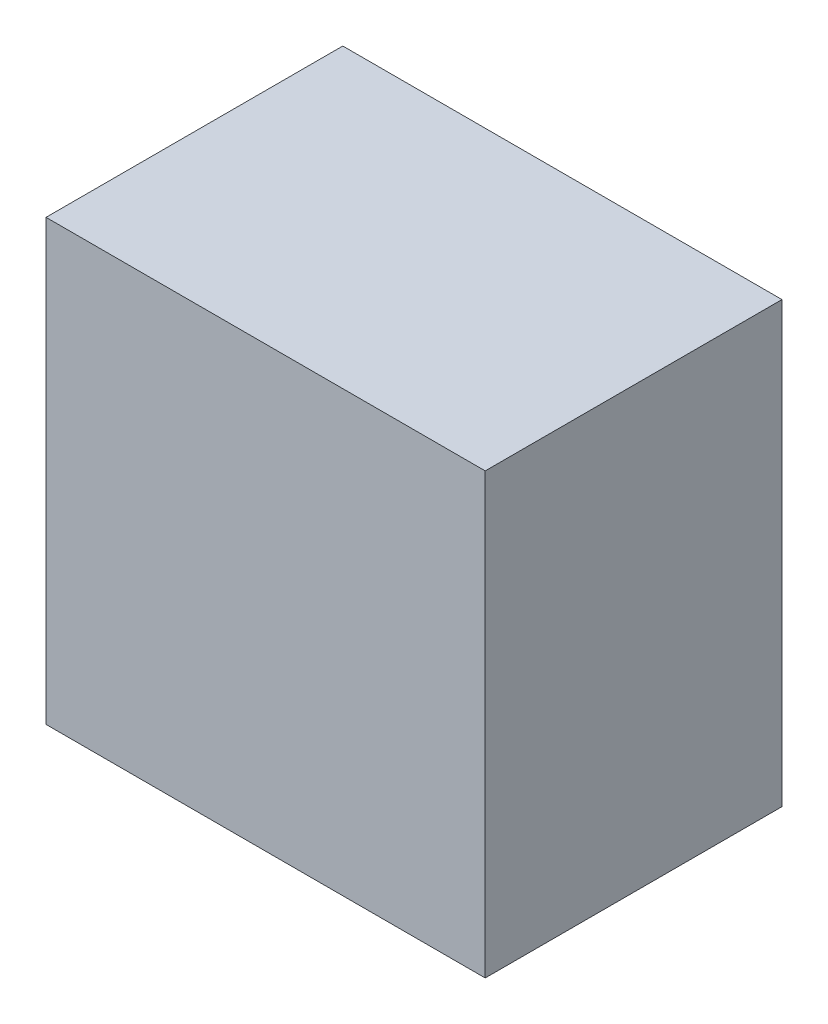
ISO-10303-21;
HEADER;
FILE_DESCRIPTION(('STEP AP214'),'2;1');
FILE_NAME('part.step','',(''),(''),'','','');
FILE_SCHEMA(('AUTOMOTIVE_DESIGN { 1 0 10303 214 1 1 1 1 }'));
ENDSEC;
DATA;
#1=APPLICATION_CONTEXT('core data for automotive mechanical design processes');
#2=APPLICATION_PROTOCOL_DEFINITION('international standard','automotive_design',2000,#1);
#3=PRODUCT_CONTEXT('',#1,'mechanical');
#4=PRODUCT('Part','Part','',(#3));
#5=PRODUCT_RELATED_PRODUCT_CATEGORY('part','',(#4));
#6=PRODUCT_DEFINITION_FORMATION('','',#4);
#7=PRODUCT_DEFINITION_CONTEXT('part definition',#1,'design');
#8=PRODUCT_DEFINITION('design','',#6,#7);
#9=PRODUCT_DEFINITION_SHAPE('','',#8);
#10=(LENGTH_UNIT() NAMED_UNIT(*) SI_UNIT(.MILLI.,.METRE.));
#11=(NAMED_UNIT(*) PLANE_ANGLE_UNIT() SI_UNIT($,.RADIAN.));
#12=(NAMED_UNIT(*) SI_UNIT($,.STERADIAN.) SOLID_ANGLE_UNIT());
#13=UNCERTAINTY_MEASURE_WITH_UNIT(LENGTH_MEASURE(1.E-05),#10,'distance_accuracy_value','');
#14=(GEOMETRIC_REPRESENTATION_CONTEXT(3) GLOBAL_UNCERTAINTY_ASSIGNED_CONTEXT((#13)) GLOBAL_UNIT_ASSIGNED_CONTEXT((#10,
#11,#12)) REPRESENTATION_CONTEXT('',''));
#15=CARTESIAN_POINT('',(0.,0.,0.));
#16=DIRECTION('',(0.,0.,1.));
#17=DIRECTION('',(1.,0.,0.));
#18=AXIS2_PLACEMENT_3D('',#15,#16,#17);
#19=CARTESIAN_POINT('',(-18.5,-18.5,25.));
#20=DIRECTION('',(1.,0.,0.));
#21=DIRECTION('',(0.,0.,-1.));
#22=AXIS2_PLACEMENT_3D('',#19,#20,#21);
#23=PLANE('',#22);
#24=DIRECTION('',(0.,-1.,0.));
#25=VECTOR('',#24,1.);
#26=CARTESIAN_POINT('',(-18.5,-18.5,0.));
#27=LINE('',#26,#25);
#28=CARTESIAN_POINT('',(-18.5,18.5,0.));
#29=VERTEX_POINT('',#28);
#30=CARTESIAN_POINT('',(-18.5,-18.5,0.));
#31=VERTEX_POINT('',#30);
#32=EDGE_CURVE('E106',#29,#31,#27,.T.);
#33=ORIENTED_EDGE('',*,*,#32,.T.);
#34=DIRECTION('',(0.,0.,-1.));
#35=VECTOR('',#34,1.);
#36=CARTESIAN_POINT('',(-18.5,-18.5,25.));
#37=LINE('',#36,#35);
#38=CARTESIAN_POINT('',(-18.5,-18.5,25.));
#39=VERTEX_POINT('',#38);
#40=EDGE_CURVE('E11',#39,#31,#37,.T.);
#41=ORIENTED_EDGE('',*,*,#40,.F.);
#42=DIRECTION('',(0.,-1.,0.));
#43=VECTOR('',#42,1.);
#44=CARTESIAN_POINT('',(-18.5,-18.5,25.));
#45=LINE('',#44,#43);
#46=CARTESIAN_POINT('',(-18.5,18.5,25.));
#47=VERTEX_POINT('',#46);
#48=EDGE_CURVE('E94',#47,#39,#45,.T.);
#49=ORIENTED_EDGE('',*,*,#48,.F.);
#50=DIRECTION('',(0.,0.,-1.));
#51=VECTOR('',#50,1.);
#52=CARTESIAN_POINT('',(-18.5,18.5,25.));
#53=LINE('',#52,#51);
#54=EDGE_CURVE('E105',#47,#29,#53,.T.);
#55=ORIENTED_EDGE('',*,*,#54,.T.);
#56=EDGE_LOOP('',(#33,#41,#49,#55));
#57=FACE_BOUND('',#56,.T.);
#58=ADVANCED_FACE('F43',(#57),#23,.F.);
#59=CARTESIAN_POINT('',(-18.5,-18.5,25.));
#60=DIRECTION('',(0.,1.,0.));
#61=DIRECTION('',(0.,0.,1.));
#62=AXIS2_PLACEMENT_3D('',#59,#60,#61);
#63=PLANE('',#62);
#64=DIRECTION('',(1.,0.,0.));
#65=VECTOR('',#64,1.);
#66=CARTESIAN_POINT('',(-18.5,-18.5,0.));
#67=LINE('',#66,#65);
#68=CARTESIAN_POINT('',(18.5,-18.5,0.));
#69=VERTEX_POINT('',#68);
#70=EDGE_CURVE('E98',#31,#69,#67,.T.);
#71=ORIENTED_EDGE('',*,*,#70,.T.);
#72=DIRECTION('',(0.,0.,-1.));
#73=VECTOR('',#72,1.);
#74=CARTESIAN_POINT('',(18.5,-18.5,25.));
#75=LINE('',#74,#73);
#76=CARTESIAN_POINT('',(18.5,-18.5,25.));
#77=VERTEX_POINT('',#76);
#78=EDGE_CURVE('E51',#77,#69,#75,.T.);
#79=ORIENTED_EDGE('',*,*,#78,.F.);
#80=DIRECTION('',(1.,0.,0.));
#81=VECTOR('',#80,1.);
#82=CARTESIAN_POINT('',(-18.5,-18.5,25.));
#83=LINE('',#82,#81);
#84=EDGE_CURVE('E90',#39,#77,#83,.T.);
#85=ORIENTED_EDGE('',*,*,#84,.F.);
#86=ORIENTED_EDGE('',*,*,#40,.T.);
#87=EDGE_LOOP('',(#71,#79,#85,#86));
#88=FACE_BOUND('',#87,.T.);
#89=ADVANCED_FACE('F100',(#88),#63,.F.);
#90=CARTESIAN_POINT('',(18.5,-18.5,25.));
#91=DIRECTION('',(-1.,0.,0.));
#92=DIRECTION('',(0.,0.,1.));
#93=AXIS2_PLACEMENT_3D('',#90,#91,#92);
#94=PLANE('',#93);
#95=DIRECTION('',(0.,1.,0.));
#96=VECTOR('',#95,1.);
#97=CARTESIAN_POINT('',(18.5,-18.5,0.));
#98=LINE('',#97,#96);
#99=CARTESIAN_POINT('',(18.5,18.5,0.));
#100=VERTEX_POINT('',#99);
#101=EDGE_CURVE('E76',#69,#100,#98,.T.);
#102=ORIENTED_EDGE('',*,*,#101,.T.);
#103=DIRECTION('',(0.,0.,-1.));
#104=VECTOR('',#103,1.);
#105=CARTESIAN_POINT('',(18.5,18.5,25.));
#106=LINE('',#105,#104);
#107=CARTESIAN_POINT('',(18.5,18.5,25.));
#108=VERTEX_POINT('',#107);
#109=EDGE_CURVE('E97',#108,#100,#106,.T.);
#110=ORIENTED_EDGE('',*,*,#109,.F.);
#111=DIRECTION('',(0.,1.,0.));
#112=VECTOR('',#111,1.);
#113=CARTESIAN_POINT('',(18.5,-18.5,25.));
#114=LINE('',#113,#112);
#115=EDGE_CURVE('E95',#77,#108,#114,.T.);
#116=ORIENTED_EDGE('',*,*,#115,.F.);
#117=ORIENTED_EDGE('',*,*,#78,.T.);
#118=EDGE_LOOP('',(#102,#110,#116,#117));
#119=FACE_BOUND('',#118,.T.);
#120=ADVANCED_FACE('F99',(#119),#94,.F.);
#121=CARTESIAN_POINT('',(-18.5,18.5,25.));
#122=DIRECTION('',(0.,-1.,0.));
#123=DIRECTION('',(0.,0.,-1.));
#124=AXIS2_PLACEMENT_3D('',#121,#122,#123);
#125=PLANE('',#124);
#126=DIRECTION('',(-1.,0.,0.));
#127=VECTOR('',#126,1.);
#128=CARTESIAN_POINT('',(-18.5,18.5,0.));
#129=LINE('',#128,#127);
#130=EDGE_CURVE('E85',#100,#29,#129,.T.);
#131=ORIENTED_EDGE('',*,*,#130,.T.);
#132=ORIENTED_EDGE('',*,*,#54,.F.);
#133=DIRECTION('',(-1.,0.,0.));
#134=VECTOR('',#133,1.);
#135=CARTESIAN_POINT('',(-18.5,18.5,25.));
#136=LINE('',#135,#134);
#137=EDGE_CURVE('E56',#108,#47,#136,.T.);
#138=ORIENTED_EDGE('',*,*,#137,.F.);
#139=ORIENTED_EDGE('',*,*,#109,.T.);
#140=EDGE_LOOP('',(#131,#132,#138,#139));
#141=FACE_BOUND('',#140,.T.);
#142=ADVANCED_FACE('F114',(#141),#125,.F.);
#143=CARTESIAN_POINT('',(0.,0.,25.));
#144=DIRECTION('',(0.,0.,-1.));
#145=DIRECTION('',(-1.,0.,0.));
#146=AXIS2_PLACEMENT_3D('',#143,#144,#145);
#147=PLANE('',#146);
#148=ORIENTED_EDGE('',*,*,#48,.T.);
#149=ORIENTED_EDGE('',*,*,#84,.T.);
#150=ORIENTED_EDGE('',*,*,#115,.T.);
#151=ORIENTED_EDGE('',*,*,#137,.T.);
#152=EDGE_LOOP('',(#148,#149,#150,#151));
#153=FACE_BOUND('',#152,.T.);
#154=ADVANCED_FACE('F89',(#153),#147,.F.);
#155=CARTESIAN_POINT('',(0.,0.,0.));
#156=DIRECTION('',(0.,0.,-1.));
#157=DIRECTION('',(-1.,0.,0.));
#158=AXIS2_PLACEMENT_3D('',#155,#156,#157);
#159=PLANE('',#158);
#160=ORIENTED_EDGE('',*,*,#32,.F.);
#161=ORIENTED_EDGE('',*,*,#130,.F.);
#162=ORIENTED_EDGE('',*,*,#101,.F.);
#163=ORIENTED_EDGE('',*,*,#70,.F.);
#164=EDGE_LOOP('',(#160,#161,#162,#163));
#165=FACE_BOUND('',#164,.T.);
#166=ADVANCED_FACE('F116',(#165),#159,.T.);
#167=CLOSED_SHELL('',(#58,#89,#120,#142,#154,#166));
#168=MANIFOLD_SOLID_BREP('B2',#167);
#169=ADVANCED_BREP_SHAPE_REPRESENTATION('',(#18,#168),#14);
#170=SHAPE_DEFINITION_REPRESENTATION(#9,#169);
ENDSEC;
END-ISO-10303-21;
